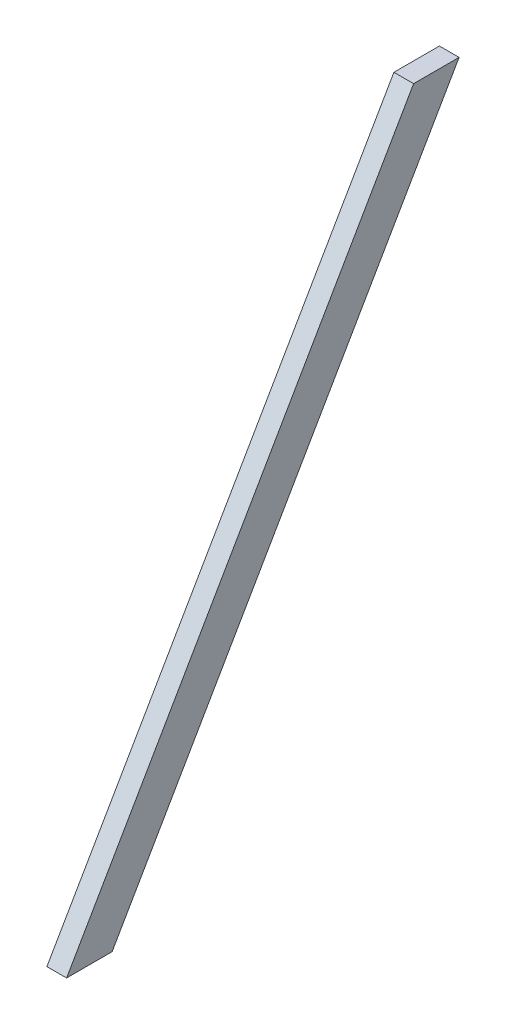
ISO-10303-21;
HEADER;
FILE_DESCRIPTION(('STEP AP214'),'2;1');
FILE_NAME('part.step','',(''),(''),'','','');
FILE_SCHEMA(('AUTOMOTIVE_DESIGN { 1 0 10303 214 1 1 1 1 }'));
ENDSEC;
DATA;
#1=APPLICATION_CONTEXT('core data for automotive mechanical design processes');
#2=APPLICATION_PROTOCOL_DEFINITION('international standard','automotive_design',2000,#1);
#3=PRODUCT_CONTEXT('',#1,'mechanical');
#4=PRODUCT('Part','Part','',(#3));
#5=PRODUCT_RELATED_PRODUCT_CATEGORY('part','',(#4));
#6=PRODUCT_DEFINITION_FORMATION('','',#4);
#7=PRODUCT_DEFINITION_CONTEXT('part definition',#1,'design');
#8=PRODUCT_DEFINITION('design','',#6,#7);
#9=PRODUCT_DEFINITION_SHAPE('','',#8);
#10=(LENGTH_UNIT() NAMED_UNIT(*) SI_UNIT(.MILLI.,.METRE.));
#11=(NAMED_UNIT(*) PLANE_ANGLE_UNIT() SI_UNIT($,.RADIAN.));
#12=(NAMED_UNIT(*) SI_UNIT($,.STERADIAN.) SOLID_ANGLE_UNIT());
#13=UNCERTAINTY_MEASURE_WITH_UNIT(LENGTH_MEASURE(1.E-05),#10,'distance_accuracy_value','');
#14=(GEOMETRIC_REPRESENTATION_CONTEXT(3) GLOBAL_UNCERTAINTY_ASSIGNED_CONTEXT((#13)) GLOBAL_UNIT_ASSIGNED_CONTEXT((#10,
#11,#12)) REPRESENTATION_CONTEXT('',''));
#15=CARTESIAN_POINT('',(0.,0.,0.));
#16=DIRECTION('',(0.,0.,1.));
#17=DIRECTION('',(1.,0.,0.));
#18=AXIS2_PLACEMENT_3D('',#15,#16,#17);
#19=CARTESIAN_POINT('',(25.4,774.735933920711,-447.294000000004));
#20=DIRECTION('',(0.,0.500000000000004,0.866025403784436));
#21=DIRECTION('',(0.,-0.866025403784436,0.500000000000004));
#22=AXIS2_PLACEMENT_3D('',#19,#20,#21);
#23=PLANE('',#22);
#24=DIRECTION('',(0.,0.866025403784436,-0.500000000000004));
#25=VECTOR('',#24,1.);
#26=CARTESIAN_POINT('',(0.,774.735933920711,-447.294000000004));
#27=LINE('',#26,#25);
#28=CARTESIAN_POINT('',(0.,0.,0.));
#29=VERTEX_POINT('',#28);
#30=CARTESIAN_POINT('',(0.,774.735933920711,-447.294000000004));
#31=VERTEX_POINT('',#30);
#32=EDGE_CURVE('E96',#29,#31,#27,.T.);
#33=ORIENTED_EDGE('',*,*,#32,.T.);
#34=DIRECTION('',(-1.,0.,0.));
#35=VECTOR('',#34,1.);
#36=CARTESIAN_POINT('',(25.4,774.735933920711,-447.294000000004));
#37=LINE('',#36,#35);
#38=CARTESIAN_POINT('',(25.4,774.735933920711,-447.294000000004));
#39=VERTEX_POINT('',#38);
#40=EDGE_CURVE('E11',#39,#31,#37,.T.);
#41=ORIENTED_EDGE('',*,*,#40,.F.);
#42=DIRECTION('',(0.,0.866025403784436,-0.500000000000004));
#43=VECTOR('',#42,1.);
#44=CARTESIAN_POINT('',(25.4,774.735933920711,-447.294000000004));
#45=LINE('',#44,#43);
#46=CARTESIAN_POINT('',(25.4,0.,0.));
#47=VERTEX_POINT('',#46);
#48=EDGE_CURVE('E84',#47,#39,#45,.T.);
#49=ORIENTED_EDGE('',*,*,#48,.F.);
#50=DIRECTION('',(-1.,0.,0.));
#51=VECTOR('',#50,1.);
#52=CARTESIAN_POINT('',(25.4,0.,0.));
#53=LINE('',#52,#51);
#54=EDGE_CURVE('E92',#47,#29,#53,.T.);
#55=ORIENTED_EDGE('',*,*,#54,.T.);
#56=EDGE_LOOP('',(#33,#41,#49,#55));
#57=FACE_BOUND('',#56,.T.);
#58=ADVANCED_FACE('F33',(#57),#23,.F.);
#59=CARTESIAN_POINT('',(25.4,774.735933920711,-388.635212650337));
#60=DIRECTION('',(0.,-1.,0.));
#61=DIRECTION('',(0.,0.,-1.));
#62=AXIS2_PLACEMENT_3D('',#59,#60,#61);
#63=PLANE('',#62);
#64=DIRECTION('',(0.,0.,1.));
#65=VECTOR('',#64,1.);
#66=CARTESIAN_POINT('',(0.,774.735933920711,-388.635212650337));
#67=LINE('',#66,#65);
#68=CARTESIAN_POINT('',(0.,774.735933920711,-388.635212650337));
#69=VERTEX_POINT('',#68);
#70=EDGE_CURVE('E88',#31,#69,#67,.T.);
#71=ORIENTED_EDGE('',*,*,#70,.T.);
#72=DIRECTION('',(-1.,0.,0.));
#73=VECTOR('',#72,1.);
#74=CARTESIAN_POINT('',(25.4,774.735933920711,-388.635212650337));
#75=LINE('',#74,#73);
#76=CARTESIAN_POINT('',(25.4,774.735933920711,-388.635212650337));
#77=VERTEX_POINT('',#76);
#78=EDGE_CURVE('E41',#77,#69,#75,.T.);
#79=ORIENTED_EDGE('',*,*,#78,.F.);
#80=DIRECTION('',(0.,0.,1.));
#81=VECTOR('',#80,1.);
#82=CARTESIAN_POINT('',(25.4,774.735933920711,-388.635212650337));
#83=LINE('',#82,#81);
#84=EDGE_CURVE('E79',#39,#77,#83,.T.);
#85=ORIENTED_EDGE('',*,*,#84,.F.);
#86=ORIENTED_EDGE('',*,*,#40,.T.);
#87=EDGE_LOOP('',(#71,#79,#85,#86));
#88=FACE_BOUND('',#87,.T.);
#89=ADVANCED_FACE('F87',(#88),#63,.F.);
#90=CARTESIAN_POINT('',(25.4,0.,58.6587873496661));
#91=DIRECTION('',(0.,-0.500000000000004,-0.866025403784436));
#92=DIRECTION('',(0.,0.866025403784436,-0.500000000000004));
#93=AXIS2_PLACEMENT_3D('',#90,#91,#92);
#94=PLANE('',#93);
#95=DIRECTION('',(0.,-0.866025403784436,0.500000000000004));
#96=VECTOR('',#95,1.);
#97=CARTESIAN_POINT('',(0.,0.,58.6587873496661));
#98=LINE('',#97,#96);
#99=CARTESIAN_POINT('',(0.,0.,58.6587873496661));
#100=VERTEX_POINT('',#99);
#101=EDGE_CURVE('E66',#69,#100,#98,.T.);
#102=ORIENTED_EDGE('',*,*,#101,.T.);
#103=DIRECTION('',(-1.,0.,0.));
#104=VECTOR('',#103,1.);
#105=CARTESIAN_POINT('',(25.4,0.,58.6587873496661));
#106=LINE('',#105,#104);
#107=CARTESIAN_POINT('',(25.4,0.,58.6587873496661));
#108=VERTEX_POINT('',#107);
#109=EDGE_CURVE('E89',#108,#100,#106,.T.);
#110=ORIENTED_EDGE('',*,*,#109,.F.);
#111=DIRECTION('',(0.,-0.866025403784436,0.500000000000004));
#112=VECTOR('',#111,1.);
#113=CARTESIAN_POINT('',(25.4,0.,58.6587873496661));
#114=LINE('',#113,#112);
#115=EDGE_CURVE('E82',#77,#108,#114,.T.);
#116=ORIENTED_EDGE('',*,*,#115,.F.);
#117=ORIENTED_EDGE('',*,*,#78,.T.);
#118=EDGE_LOOP('',(#102,#110,#116,#117));
#119=FACE_BOUND('',#118,.T.);
#120=ADVANCED_FACE('F90',(#119),#94,.F.);
#121=CARTESIAN_POINT('',(25.4,0.,0.));
#122=DIRECTION('',(0.,1.,0.));
#123=DIRECTION('',(0.,0.,1.));
#124=AXIS2_PLACEMENT_3D('',#121,#122,#123);
#125=PLANE('',#124);
#126=DIRECTION('',(0.,0.,-1.));
#127=VECTOR('',#126,1.);
#128=CARTESIAN_POINT('',(0.,0.,0.));
#129=LINE('',#128,#127);
#130=EDGE_CURVE('E72',#100,#29,#129,.T.);
#131=ORIENTED_EDGE('',*,*,#130,.T.);
#132=ORIENTED_EDGE('',*,*,#54,.F.);
#133=DIRECTION('',(0.,0.,-1.));
#134=VECTOR('',#133,1.);
#135=CARTESIAN_POINT('',(25.4,0.,0.));
#136=LINE('',#135,#134);
#137=EDGE_CURVE('E49',#108,#47,#136,.T.);
#138=ORIENTED_EDGE('',*,*,#137,.F.);
#139=ORIENTED_EDGE('',*,*,#109,.T.);
#140=EDGE_LOOP('',(#131,#132,#138,#139));
#141=FACE_BOUND('',#140,.T.);
#142=ADVANCED_FACE('F103',(#141),#125,.F.);
#143=CARTESIAN_POINT('',(25.4,0.,0.));
#144=DIRECTION('',(-1.,0.,0.));
#145=DIRECTION('',(0.,0.,1.));
#146=AXIS2_PLACEMENT_3D('',#143,#144,#145);
#147=PLANE('',#146);
#148=ORIENTED_EDGE('',*,*,#48,.T.);
#149=ORIENTED_EDGE('',*,*,#84,.T.);
#150=ORIENTED_EDGE('',*,*,#115,.T.);
#151=ORIENTED_EDGE('',*,*,#137,.T.);
#152=EDGE_LOOP('',(#148,#149,#150,#151));
#153=FACE_BOUND('',#152,.T.);
#154=ADVANCED_FACE('F80',(#153),#147,.F.);
#155=CARTESIAN_POINT('',(0.,0.,0.));
#156=DIRECTION('',(-1.,0.,0.));
#157=DIRECTION('',(0.,0.,1.));
#158=AXIS2_PLACEMENT_3D('',#155,#156,#157);
#159=PLANE('',#158);
#160=ORIENTED_EDGE('',*,*,#32,.F.);
#161=ORIENTED_EDGE('',*,*,#130,.F.);
#162=ORIENTED_EDGE('',*,*,#101,.F.);
#163=ORIENTED_EDGE('',*,*,#70,.F.);
#164=EDGE_LOOP('',(#160,#161,#162,#163));
#165=FACE_BOUND('',#164,.T.);
#166=ADVANCED_FACE('F106',(#165),#159,.T.);
#167=CLOSED_SHELL('',(#58,#89,#120,#142,#154,#166));
#168=MANIFOLD_SOLID_BREP('B2',#167);
#169=ADVANCED_BREP_SHAPE_REPRESENTATION('',(#18,#168),#14);
#170=SHAPE_DEFINITION_REPRESENTATION(#9,#169);
ENDSEC;
END-ISO-10303-21;
